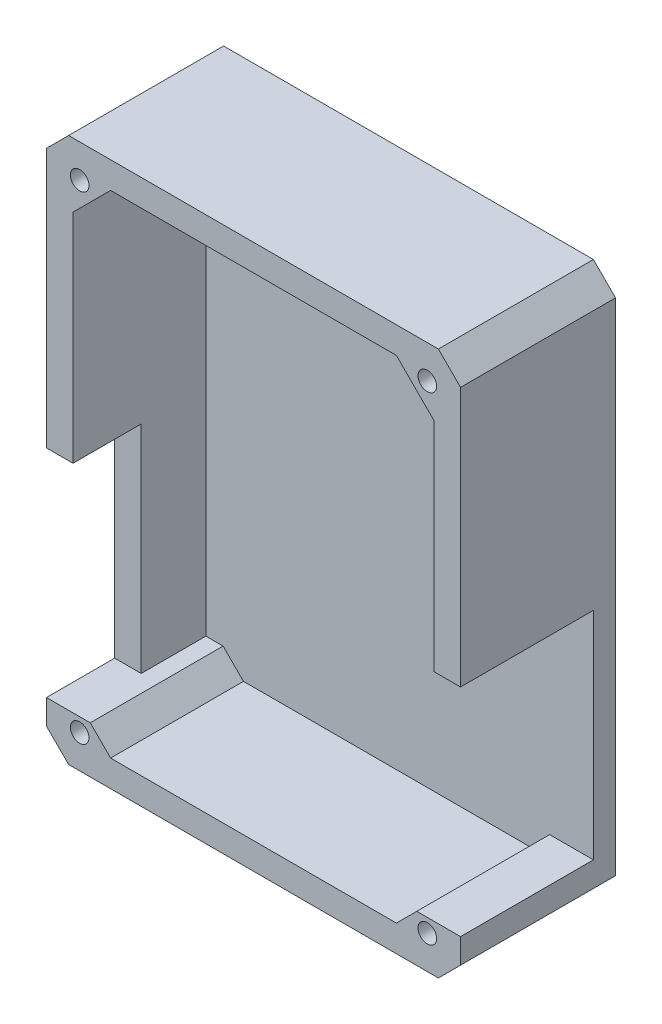
ISO-10303-21;
HEADER;
FILE_DESCRIPTION(('STEP AP214'),'2;1');
FILE_NAME('part.step','',(''),(''),'','','');
FILE_SCHEMA(('AUTOMOTIVE_DESIGN { 1 0 10303 214 1 1 1 1 }'));
ENDSEC;
DATA;
#1=APPLICATION_CONTEXT('core data for automotive mechanical design processes');
#2=APPLICATION_PROTOCOL_DEFINITION('international standard','automotive_design',2000,#1);
#3=PRODUCT_CONTEXT('',#1,'mechanical');
#4=PRODUCT('Part','Part','',(#3));
#5=PRODUCT_RELATED_PRODUCT_CATEGORY('part','',(#4));
#6=PRODUCT_DEFINITION_FORMATION('','',#4);
#7=PRODUCT_DEFINITION_CONTEXT('part definition',#1,'design');
#8=PRODUCT_DEFINITION('design','',#6,#7);
#9=PRODUCT_DEFINITION_SHAPE('','',#8);
#10=(LENGTH_UNIT() NAMED_UNIT(*) SI_UNIT(.MILLI.,.METRE.));
#11=(NAMED_UNIT(*) PLANE_ANGLE_UNIT() SI_UNIT($,.RADIAN.));
#12=(NAMED_UNIT(*) SI_UNIT($,.STERADIAN.) SOLID_ANGLE_UNIT());
#13=UNCERTAINTY_MEASURE_WITH_UNIT(LENGTH_MEASURE(1.E-05),#10,'distance_accuracy_value','');
#14=(GEOMETRIC_REPRESENTATION_CONTEXT(3) GLOBAL_UNCERTAINTY_ASSIGNED_CONTEXT((#13)) GLOBAL_UNIT_ASSIGNED_CONTEXT((#10,
#11,#12)) REPRESENTATION_CONTEXT('',''));
#15=CARTESIAN_POINT('',(0.,0.,0.));
#16=DIRECTION('',(0.,0.,1.));
#17=DIRECTION('',(1.,0.,0.));
#18=AXIS2_PLACEMENT_3D('',#15,#16,#17);
#19=CARTESIAN_POINT('',(0.,0.,5.));
#20=DIRECTION('',(0.,0.,-1.));
#21=DIRECTION('',(-1.,0.,0.));
#22=AXIS2_PLACEMENT_3D('',#19,#20,#21);
#23=PLANE('',#22);
#24=DIRECTION('',(0.,1.,0.));
#25=VECTOR('',#24,1.);
#26=CARTESIAN_POINT('',(-40.75,0.,5.));
#27=LINE('',#26,#25);
#28=CARTESIAN_POINT('',(-40.75,-22.4,5.));
#29=VERTEX_POINT('',#28);
#30=CARTESIAN_POINT('',(-40.75,75.5147186257614,5.));
#31=VERTEX_POINT('',#30);
#32=EDGE_CURVE('E382',#29,#31,#27,.T.);
#33=ORIENTED_EDGE('',*,*,#32,.F.);
#34=DIRECTION('',(1.,0.,0.));
#35=VECTOR('',#34,1.);
#36=CARTESIAN_POINT('',(0.,-22.3999999999999,5.));
#37=LINE('',#36,#35);
#38=CARTESIAN_POINT('',(-36.8647186257614,-22.4,5.));
#39=VERTEX_POINT('',#38);
#40=EDGE_CURVE('E310',#29,#39,#37,.T.);
#41=ORIENTED_EDGE('',*,*,#40,.T.);
#42=DIRECTION('',(0.707106781186546,-0.707106781186549,0.));
#43=VECTOR('',#42,1.);
#44=CARTESIAN_POINT('',(-29.6323593128808,-29.6323593128807,5.));
#45=LINE('',#44,#43);
#46=CARTESIAN_POINT('',(-32.2647186257614,-27.,5.));
#47=VERTEX_POINT('',#46);
#48=EDGE_CURVE('E309',#39,#47,#45,.T.);
#49=ORIENTED_EDGE('',*,*,#48,.T.);
#50=DIRECTION('',(1.,0.,0.));
#51=VECTOR('',#50,1.);
#52=CARTESIAN_POINT('',(0.,-27.,5.));
#53=LINE('',#52,#51);
#54=CARTESIAN_POINT('',(32.2647186257614,-27.,5.));
#55=VERTEX_POINT('',#54);
#56=EDGE_CURVE('E307',#47,#55,#53,.T.);
#57=ORIENTED_EDGE('',*,*,#56,.T.);
#58=DIRECTION('',(-0.707106781186546,-0.707106781186549,0.));
#59=VECTOR('',#58,1.);
#60=CARTESIAN_POINT('',(29.6323593128808,-29.6323593128807,5.));
#61=LINE('',#60,#59);
#62=CARTESIAN_POINT('',(36.8647186257614,-22.4,5.));
#63=VERTEX_POINT('',#62);
#64=EDGE_CURVE('E303',#63,#55,#61,.T.);
#65=ORIENTED_EDGE('',*,*,#64,.F.);
#66=DIRECTION('',(1.,0.,0.));
#67=VECTOR('',#66,1.);
#68=CARTESIAN_POINT('',(0.,-22.4,5.));
#69=LINE('',#68,#67);
#70=CARTESIAN_POINT('',(46.75,-22.4,5.));
#71=VERTEX_POINT('',#70);
#72=EDGE_CURVE('E301',#63,#71,#69,.T.);
#73=ORIENTED_EDGE('',*,*,#72,.T.);
#74=DIRECTION('',(0.,1.,0.));
#75=VECTOR('',#74,1.);
#76=CARTESIAN_POINT('',(46.75,-33.,5.));
#77=LINE('',#76,#75);
#78=CARTESIAN_POINT('',(46.75,26.4,5.));
#79=VERTEX_POINT('',#78);
#80=EDGE_CURVE('E236',#71,#79,#77,.T.);
#81=ORIENTED_EDGE('',*,*,#80,.T.);
#82=DIRECTION('',(1.,0.,0.));
#83=VECTOR('',#82,1.);
#84=CARTESIAN_POINT('',(0.,26.4,5.));
#85=LINE('',#84,#83);
#86=CARTESIAN_POINT('',(40.75,26.4,5.));
#87=VERTEX_POINT('',#86);
#88=EDGE_CURVE('E385',#87,#79,#85,.T.);
#89=ORIENTED_EDGE('',*,*,#88,.F.);
#90=DIRECTION('',(0.,-1.,0.));
#91=VECTOR('',#90,1.);
#92=CARTESIAN_POINT('',(40.75,0.,5.));
#93=LINE('',#92,#91);
#94=CARTESIAN_POINT('',(40.75,75.5147186257614,5.));
#95=VERTEX_POINT('',#94);
#96=EDGE_CURVE('E387',#95,#87,#93,.T.);
#97=ORIENTED_EDGE('',*,*,#96,.F.);
#98=DIRECTION('',(-0.707106781186546,0.707106781186549,0.));
#99=VECTOR('',#98,1.);
#100=CARTESIAN_POINT('',(58.1323593128808,58.1323593128806,5.));
#101=LINE('',#100,#99);
#102=CARTESIAN_POINT('',(32.2647186257614,84.,5.));
#103=VERTEX_POINT('',#102);
#104=EDGE_CURVE('E390',#95,#103,#101,.T.);
#105=ORIENTED_EDGE('',*,*,#104,.T.);
#106=DIRECTION('',(1.,0.,0.));
#107=VECTOR('',#106,1.);
#108=CARTESIAN_POINT('',(0.,84.,5.));
#109=LINE('',#108,#107);
#110=CARTESIAN_POINT('',(-32.2647186257614,84.,5.));
#111=VERTEX_POINT('',#110);
#112=EDGE_CURVE('E375',#111,#103,#109,.T.);
#113=ORIENTED_EDGE('',*,*,#112,.F.);
#114=DIRECTION('',(0.707106781186546,0.707106781186549,0.));
#115=VECTOR('',#114,1.);
#116=CARTESIAN_POINT('',(-58.1323593128808,58.1323593128806,5.));
#117=LINE('',#116,#115);
#118=EDGE_CURVE('E379',#31,#111,#117,.T.);
#119=ORIENTED_EDGE('',*,*,#118,.F.);
#120=EDGE_LOOP('',(#33,#41,#49,#57,#65,#73,#81,#89,#97,#105,#113,#119));
#121=FACE_BOUND('',#120,.T.);
#122=ADVANCED_FACE('F34',(#121),#23,.F.);
#123=CARTESIAN_POINT('',(0.,-22.3999999999999,35.));
#124=DIRECTION('',(0.,1.,0.));
#125=DIRECTION('',(-1.,0.,0.));
#126=AXIS2_PLACEMENT_3D('',#123,#124,#125);
#127=PLANE('',#126);
#128=ORIENTED_EDGE('',*,*,#40,.F.);
#129=DIRECTION('',(0.,0.,-1.));
#130=VECTOR('',#129,1.);
#131=CARTESIAN_POINT('',(-40.75,-22.4,19.6));
#132=LINE('',#131,#130);
#133=CARTESIAN_POINT('',(-40.75,-22.4,19.6));
#134=VERTEX_POINT('',#133);
#135=EDGE_CURVE('E210',#134,#29,#132,.T.);
#136=ORIENTED_EDGE('',*,*,#135,.F.);
#137=DIRECTION('',(1.,0.,0.));
#138=VECTOR('',#137,1.);
#139=CARTESIAN_POINT('',(-46.75,-22.4,19.6));
#140=LINE('',#139,#138);
#141=CARTESIAN_POINT('',(-46.75,-22.4,19.6));
#142=VERTEX_POINT('',#141);
#143=EDGE_CURVE('E194',#142,#134,#140,.T.);
#144=ORIENTED_EDGE('',*,*,#143,.F.);
#145=DIRECTION('',(0.,0.,-1.));
#146=VECTOR('',#145,1.);
#147=CARTESIAN_POINT('',(-46.75,-22.4,35.));
#148=LINE('',#147,#146);
#149=CARTESIAN_POINT('',(-46.75,-22.4,35.));
#150=VERTEX_POINT('',#149);
#151=EDGE_CURVE('E208',#150,#142,#148,.T.);
#152=ORIENTED_EDGE('',*,*,#151,.F.);
#153=DIRECTION('',(1.,0.,0.));
#154=VECTOR('',#153,1.);
#155=CARTESIAN_POINT('',(0.,-22.3999999999999,35.));
#156=LINE('',#155,#154);
#157=CARTESIAN_POINT('',(-36.8647186257614,-22.4,35.));
#158=VERTEX_POINT('',#157);
#159=EDGE_CURVE('E297',#150,#158,#156,.T.);
#160=ORIENTED_EDGE('',*,*,#159,.T.);
#161=DIRECTION('',(0.,0.,-1.));
#162=VECTOR('',#161,1.);
#163=CARTESIAN_POINT('',(-36.8647186257614,-22.4,35.));
#164=LINE('',#163,#162);
#165=EDGE_CURVE('E216',#158,#39,#164,.T.);
#166=ORIENTED_EDGE('',*,*,#165,.T.);
#167=EDGE_LOOP('',(#128,#136,#144,#152,#160,#166));
#168=FACE_BOUND('',#167,.T.);
#169=ADVANCED_FACE('F206',(#168),#127,.T.);
#170=CARTESIAN_POINT('',(-46.75,-33.,5.));
#171=DIRECTION('',(1.,0.,0.));
#172=DIRECTION('',(0.,0.,-1.));
#173=AXIS2_PLACEMENT_3D('',#170,#171,#172);
#174=PLANE('',#173);
#175=DIRECTION('',(0.,-1.,0.));
#176=VECTOR('',#175,1.);
#177=CARTESIAN_POINT('',(-46.75,-33.,0.));
#178=LINE('',#177,#176);
#179=CARTESIAN_POINT('',(-46.75,85.,0.));
#180=VERTEX_POINT('',#179);
#181=CARTESIAN_POINT('',(-46.75,-28.,0.));
#182=VERTEX_POINT('',#181);
#183=EDGE_CURVE('E235',#180,#182,#178,.T.);
#184=ORIENTED_EDGE('',*,*,#183,.T.);
#185=DIRECTION('',(0.,0.,1.));
#186=VECTOR('',#185,1.);
#187=CARTESIAN_POINT('',(-46.75,-28.,5.));
#188=LINE('',#187,#186);
#189=CARTESIAN_POINT('',(-46.75,-28.,35.));
#190=VERTEX_POINT('',#189);
#191=EDGE_CURVE('E11',#182,#190,#188,.T.);
#192=ORIENTED_EDGE('',*,*,#191,.T.);
#193=DIRECTION('',(0.,-1.,0.));
#194=VECTOR('',#193,1.);
#195=CARTESIAN_POINT('',(-46.75,0.,35.));
#196=LINE('',#195,#194);
#197=EDGE_CURVE('E214',#150,#190,#196,.T.);
#198=ORIENTED_EDGE('',*,*,#197,.F.);
#199=ORIENTED_EDGE('',*,*,#151,.T.);
#200=DIRECTION('',(0.,-1.,0.));
#201=VECTOR('',#200,1.);
#202=CARTESIAN_POINT('',(-46.75,26.4,19.6));
#203=LINE('',#202,#201);
#204=CARTESIAN_POINT('',(-46.75,26.4,19.6));
#205=VERTEX_POINT('',#204);
#206=EDGE_CURVE('E191',#205,#142,#203,.T.);
#207=ORIENTED_EDGE('',*,*,#206,.F.);
#208=DIRECTION('',(0.,0.,-1.));
#209=VECTOR('',#208,1.);
#210=CARTESIAN_POINT('',(-46.75,26.4,35.));
#211=LINE('',#210,#209);
#212=CARTESIAN_POINT('',(-46.75,26.4,35.));
#213=VERTEX_POINT('',#212);
#214=EDGE_CURVE('E357',#213,#205,#211,.T.);
#215=ORIENTED_EDGE('',*,*,#214,.F.);
#216=DIRECTION('',(0.,-1.,0.));
#217=VECTOR('',#216,1.);
#218=CARTESIAN_POINT('',(-46.75,0.,35.));
#219=LINE('',#218,#217);
#220=CARTESIAN_POINT('',(-46.75,85.,35.));
#221=VERTEX_POINT('',#220);
#222=EDGE_CURVE('E280',#221,#213,#219,.T.);
#223=ORIENTED_EDGE('',*,*,#222,.F.);
#224=DIRECTION('',(0.,0.,-1.));
#225=VECTOR('',#224,1.);
#226=CARTESIAN_POINT('',(-46.75,85.,5.));
#227=LINE('',#226,#225);
#228=EDGE_CURVE('E43',#221,#180,#227,.T.);
#229=ORIENTED_EDGE('',*,*,#228,.T.);
#230=EDGE_LOOP('',(#184,#192,#198,#199,#207,#215,#223,#229));
#231=FACE_BOUND('',#230,.T.);
#232=ADVANCED_FACE('F213',(#231),#174,.F.);
#233=CARTESIAN_POINT('',(-46.75,-33.,5.));
#234=DIRECTION('',(0.,1.,0.));
#235=DIRECTION('',(0.,0.,1.));
#236=AXIS2_PLACEMENT_3D('',#233,#234,#235);
#237=PLANE('',#236);
#238=DIRECTION('',(1.,0.,0.));
#239=VECTOR('',#238,1.);
#240=CARTESIAN_POINT('',(-46.75,-33.,0.));
#241=LINE('',#240,#239);
#242=CARTESIAN_POINT('',(-41.75,-33.,0.));
#243=VERTEX_POINT('',#242);
#244=CARTESIAN_POINT('',(41.75,-33.,0.));
#245=VERTEX_POINT('',#244);
#246=EDGE_CURVE('E241',#243,#245,#241,.T.);
#247=ORIENTED_EDGE('',*,*,#246,.T.);
#248=DIRECTION('',(0.,0.,1.));
#249=VECTOR('',#248,1.);
#250=CARTESIAN_POINT('',(41.75,-33.,5.));
#251=LINE('',#250,#249);
#252=CARTESIAN_POINT('',(41.75,-33.,35.));
#253=VERTEX_POINT('',#252);
#254=EDGE_CURVE('E56',#245,#253,#251,.T.);
#255=ORIENTED_EDGE('',*,*,#254,.T.);
#256=DIRECTION('',(1.,0.,0.));
#257=VECTOR('',#256,1.);
#258=CARTESIAN_POINT('',(0.,-33.,35.));
#259=LINE('',#258,#257);
#260=CARTESIAN_POINT('',(-41.75,-33.,35.));
#261=VERTEX_POINT('',#260);
#262=EDGE_CURVE('E292',#261,#253,#259,.T.);
#263=ORIENTED_EDGE('',*,*,#262,.F.);
#264=DIRECTION('',(0.,0.,-1.));
#265=VECTOR('',#264,1.);
#266=CARTESIAN_POINT('',(-41.75,-33.,5.));
#267=LINE('',#266,#265);
#268=EDGE_CURVE('E269',#261,#243,#267,.T.);
#269=ORIENTED_EDGE('',*,*,#268,.T.);
#270=EDGE_LOOP('',(#247,#255,#263,#269));
#271=FACE_BOUND('',#270,.T.);
#272=ADVANCED_FACE('F291',(#271),#237,.F.);
#273=CARTESIAN_POINT('',(46.75,-33.,5.));
#274=DIRECTION('',(-1.,0.,0.));
#275=DIRECTION('',(0.,0.,1.));
#276=AXIS2_PLACEMENT_3D('',#273,#274,#275);
#277=PLANE('',#276);
#278=DIRECTION('',(0.,1.,0.));
#279=VECTOR('',#278,1.);
#280=CARTESIAN_POINT('',(46.75,-33.,0.));
#281=LINE('',#280,#279);
#282=CARTESIAN_POINT('',(46.75,-28.,0.));
#283=VERTEX_POINT('',#282);
#284=CARTESIAN_POINT('',(46.75,85.,0.));
#285=VERTEX_POINT('',#284);
#286=EDGE_CURVE('E243',#283,#285,#281,.T.);
#287=ORIENTED_EDGE('',*,*,#286,.T.);
#288=DIRECTION('',(0.,0.,1.));
#289=VECTOR('',#288,1.);
#290=CARTESIAN_POINT('',(46.75,85.,5.));
#291=LINE('',#290,#289);
#292=CARTESIAN_POINT('',(46.75,85.,35.));
#293=VERTEX_POINT('',#292);
#294=EDGE_CURVE('E263',#285,#293,#291,.T.);
#295=ORIENTED_EDGE('',*,*,#294,.T.);
#296=DIRECTION('',(0.,1.,0.));
#297=VECTOR('',#296,1.);
#298=CARTESIAN_POINT('',(46.75,0.,35.));
#299=LINE('',#298,#297);
#300=CARTESIAN_POINT('',(46.75,26.4,35.));
#301=VERTEX_POINT('',#300);
#302=EDGE_CURVE('E353',#301,#293,#299,.T.);
#303=ORIENTED_EDGE('',*,*,#302,.F.);
#304=DIRECTION('',(0.,0.,-1.));
#305=VECTOR('',#304,1.);
#306=CARTESIAN_POINT('',(46.75,26.4,35.));
#307=LINE('',#306,#305);
#308=EDGE_CURVE('E351',#301,#79,#307,.T.);
#309=ORIENTED_EDGE('',*,*,#308,.T.);
#310=ORIENTED_EDGE('',*,*,#80,.F.);
#311=DIRECTION('',(0.,0.,-1.));
#312=VECTOR('',#311,1.);
#313=CARTESIAN_POINT('',(46.75,-22.4,35.));
#314=LINE('',#313,#312);
#315=CARTESIAN_POINT('',(46.75,-22.4,35.));
#316=VERTEX_POINT('',#315);
#317=EDGE_CURVE('E217',#316,#71,#314,.T.);
#318=ORIENTED_EDGE('',*,*,#317,.F.);
#319=DIRECTION('',(0.,1.,0.));
#320=VECTOR('',#319,1.);
#321=CARTESIAN_POINT('',(46.75,0.,35.));
#322=LINE('',#321,#320);
#323=CARTESIAN_POINT('',(46.75,-28.,35.));
#324=VERTEX_POINT('',#323);
#325=EDGE_CURVE('E223',#324,#316,#322,.T.);
#326=ORIENTED_EDGE('',*,*,#325,.F.);
#327=DIRECTION('',(0.,0.,-1.));
#328=VECTOR('',#327,1.);
#329=CARTESIAN_POINT('',(46.75,-28.,5.));
#330=LINE('',#329,#328);
#331=EDGE_CURVE('E260',#324,#283,#330,.T.);
#332=ORIENTED_EDGE('',*,*,#331,.T.);
#333=EDGE_LOOP('',(#287,#295,#303,#309,#310,#318,#326,#332));
#334=FACE_BOUND('',#333,.T.);
#335=ADVANCED_FACE('F347',(#334),#277,.F.);
#336=CARTESIAN_POINT('',(-46.75,90.,5.));
#337=DIRECTION('',(0.,-1.,0.));
#338=DIRECTION('',(0.,0.,-1.));
#339=AXIS2_PLACEMENT_3D('',#336,#337,#338);
#340=PLANE('',#339);
#341=DIRECTION('',(-1.,0.,0.));
#342=VECTOR('',#341,1.);
#343=CARTESIAN_POINT('',(0.,90.,35.));
#344=LINE('',#343,#342);
#345=CARTESIAN_POINT('',(41.75,90.,35.));
#346=VERTEX_POINT('',#345);
#347=CARTESIAN_POINT('',(-41.75,90.,35.));
#348=VERTEX_POINT('',#347);
#349=EDGE_CURVE('E400',#346,#348,#344,.T.);
#350=ORIENTED_EDGE('',*,*,#349,.F.);
#351=DIRECTION('',(0.,0.,-1.));
#352=VECTOR('',#351,1.);
#353=CARTESIAN_POINT('',(41.75,90.,5.));
#354=LINE('',#353,#352);
#355=CARTESIAN_POINT('',(41.75,90.,0.));
#356=VERTEX_POINT('',#355);
#357=EDGE_CURVE('E249',#346,#356,#354,.T.);
#358=ORIENTED_EDGE('',*,*,#357,.T.);
#359=DIRECTION('',(-1.,0.,0.));
#360=VECTOR('',#359,1.);
#361=CARTESIAN_POINT('',(-46.75,90.,0.));
#362=LINE('',#361,#360);
#363=CARTESIAN_POINT('',(-41.75,90.,0.));
#364=VERTEX_POINT('',#363);
#365=EDGE_CURVE('E239',#356,#364,#362,.T.);
#366=ORIENTED_EDGE('',*,*,#365,.T.);
#367=DIRECTION('',(0.,0.,1.));
#368=VECTOR('',#367,1.);
#369=CARTESIAN_POINT('',(-41.75,90.,5.));
#370=LINE('',#369,#368);
#371=EDGE_CURVE('E238',#364,#348,#370,.T.);
#372=ORIENTED_EDGE('',*,*,#371,.T.);
#373=EDGE_LOOP('',(#350,#358,#366,#372));
#374=FACE_BOUND('',#373,.T.);
#375=ADVANCED_FACE('F472',(#374),#340,.F.);
#376=CARTESIAN_POINT('',(0.,0.,0.));
#377=DIRECTION('',(0.,0.,-1.));
#378=DIRECTION('',(-1.,0.,0.));
#379=AXIS2_PLACEMENT_3D('',#376,#377,#378);
#380=PLANE('',#379);
#381=CARTESIAN_POINT('',(-33.3074446131292,-24.,0.));
#382=DIRECTION('',(0.,0.,-1.));
#383=DIRECTION('',(1.,0.,0.));
#384=AXIS2_PLACEMENT_3D('',#381,#382,#383);
#385=CIRCLE('',#384,2.1);
#386=CARTESIAN_POINT('',(-31.2074446131292,-24.,0.));
#387=VERTEX_POINT('',#386);
#388=EDGE_CURVE('E443',#387,#387,#385,.T.);
#389=ORIENTED_EDGE('',*,*,#388,.F.);
#390=EDGE_LOOP('',(#389));
#391=FACE_BOUND('',#390,.T.);
#392=CARTESIAN_POINT('',(-33.3074446131292,32.,0.));
#393=DIRECTION('',(0.,0.,-1.));
#394=DIRECTION('',(1.,0.,0.));
#395=AXIS2_PLACEMENT_3D('',#392,#393,#394);
#396=CIRCLE('',#395,2.1);
#397=CARTESIAN_POINT('',(-31.2074446131292,32.,0.));
#398=VERTEX_POINT('',#397);
#399=EDGE_CURVE('E449',#398,#398,#396,.T.);
#400=ORIENTED_EDGE('',*,*,#399,.F.);
#401=EDGE_LOOP('',(#400));
#402=FACE_BOUND('',#401,.T.);
#403=CARTESIAN_POINT('',(33.3074446131292,32.,0.));
#404=DIRECTION('',(0.,0.,-1.));
#405=DIRECTION('',(-1.,0.,0.));
#406=AXIS2_PLACEMENT_3D('',#403,#404,#405);
#407=CIRCLE('',#406,2.1);
#408=CARTESIAN_POINT('',(31.2074446131292,32.,0.));
#409=VERTEX_POINT('',#408);
#410=EDGE_CURVE('E455',#409,#409,#407,.T.);
#411=ORIENTED_EDGE('',*,*,#410,.F.);
#412=EDGE_LOOP('',(#411));
#413=FACE_BOUND('',#412,.T.);
#414=CARTESIAN_POINT('',(33.3074446131292,-24.,0.));
#415=DIRECTION('',(0.,0.,-1.));
#416=DIRECTION('',(-1.,0.,0.));
#417=AXIS2_PLACEMENT_3D('',#414,#415,#416);
#418=CIRCLE('',#417,2.1);
#419=CARTESIAN_POINT('',(31.2074446131292,-24.,0.));
#420=VERTEX_POINT('',#419);
#421=EDGE_CURVE('E437',#420,#420,#418,.T.);
#422=ORIENTED_EDGE('',*,*,#421,.F.);
#423=EDGE_LOOP('',(#422));
#424=FACE_BOUND('',#423,.T.);
#425=ORIENTED_EDGE('',*,*,#365,.F.);
#426=DIRECTION('',(-0.707106781186545,0.70710678118655,0.));
#427=VECTOR('',#426,1.);
#428=CARTESIAN_POINT('',(65.8750000000002,65.8749999999997,0.));
#429=LINE('',#428,#427);
#430=EDGE_CURVE('E258',#356,#285,#429,.F.);
#431=ORIENTED_EDGE('',*,*,#430,.T.);
#432=ORIENTED_EDGE('',*,*,#286,.F.);
#433=DIRECTION('',(0.707106781186548,0.707106781186547,0.));
#434=VECTOR('',#433,1.);
#435=CARTESIAN_POINT('',(37.375,-37.375,0.));
#436=LINE('',#435,#434);
#437=EDGE_CURVE('E256',#283,#245,#436,.F.);
#438=ORIENTED_EDGE('',*,*,#437,.T.);
#439=ORIENTED_EDGE('',*,*,#246,.F.);
#440=DIRECTION('',(0.707106781186546,-0.707106781186549,0.));
#441=VECTOR('',#440,1.);
#442=CARTESIAN_POINT('',(-37.3750000000001,-37.3749999999999,0.));
#443=LINE('',#442,#441);
#444=EDGE_CURVE('E254',#243,#182,#443,.F.);
#445=ORIENTED_EDGE('',*,*,#444,.T.);
#446=ORIENTED_EDGE('',*,*,#183,.F.);
#447=DIRECTION('',(-0.707106781186549,-0.707106781186547,0.));
#448=VECTOR('',#447,1.);
#449=CARTESIAN_POINT('',(-65.8749999999999,65.8750000000001,0.));
#450=LINE('',#449,#448);
#451=EDGE_CURVE('E252',#180,#364,#450,.F.);
#452=ORIENTED_EDGE('',*,*,#451,.T.);
#453=EDGE_LOOP('',(#425,#431,#432,#438,#439,#445,#446,#452));
#454=FACE_BOUND('',#453,.T.);
#455=ADVANCED_FACE('F285',(#391,#402,#413,#424,#454),#380,.T.);
#456=CARTESIAN_POINT('',(0.,-22.4,35.));
#457=DIRECTION('',(0.,1.,0.));
#458=DIRECTION('',(0.,0.,1.));
#459=AXIS2_PLACEMENT_3D('',#456,#457,#458);
#460=PLANE('',#459);
#461=ORIENTED_EDGE('',*,*,#72,.F.);
#462=DIRECTION('',(0.,0.,-1.));
#463=VECTOR('',#462,1.);
#464=CARTESIAN_POINT('',(36.8647186257614,-22.4,35.));
#465=LINE('',#464,#463);
#466=CARTESIAN_POINT('',(36.8647186257614,-22.4,35.));
#467=VERTEX_POINT('',#466);
#468=EDGE_CURVE('E232',#467,#63,#465,.T.);
#469=ORIENTED_EDGE('',*,*,#468,.F.);
#470=DIRECTION('',(1.,0.,0.));
#471=VECTOR('',#470,1.);
#472=CARTESIAN_POINT('',(0.,-22.4,35.));
#473=LINE('',#472,#471);
#474=EDGE_CURVE('E311',#467,#316,#473,.T.);
#475=ORIENTED_EDGE('',*,*,#474,.T.);
#476=ORIENTED_EDGE('',*,*,#317,.T.);
#477=EDGE_LOOP('',(#461,#469,#475,#476));
#478=FACE_BOUND('',#477,.T.);
#479=ADVANCED_FACE('F341',(#478),#460,.T.);
#480=CARTESIAN_POINT('',(29.6323593128808,-29.6323593128807,35.));
#481=DIRECTION('',(0.707106781186549,-0.707106781186546,0.));
#482=DIRECTION('',(0.707106781186546,0.707106781186549,0.));
#483=AXIS2_PLACEMENT_3D('',#480,#481,#482);
#484=PLANE('',#483);
#485=ORIENTED_EDGE('',*,*,#64,.T.);
#486=DIRECTION('',(0.,0.,-1.));
#487=VECTOR('',#486,1.);
#488=CARTESIAN_POINT('',(32.2647186257614,-27.,35.));
#489=LINE('',#488,#487);
#490=CARTESIAN_POINT('',(32.2647186257614,-27.,35.));
#491=VERTEX_POINT('',#490);
#492=EDGE_CURVE('E229',#491,#55,#489,.T.);
#493=ORIENTED_EDGE('',*,*,#492,.F.);
#494=DIRECTION('',(-0.707106781186546,-0.707106781186549,0.));
#495=VECTOR('',#494,1.);
#496=CARTESIAN_POINT('',(29.6323593128808,-29.6323593128807,35.));
#497=LINE('',#496,#495);
#498=EDGE_CURVE('E314',#467,#491,#497,.T.);
#499=ORIENTED_EDGE('',*,*,#498,.F.);
#500=ORIENTED_EDGE('',*,*,#468,.T.);
#501=EDGE_LOOP('',(#485,#493,#499,#500));
#502=FACE_BOUND('',#501,.T.);
#503=ADVANCED_FACE('F339',(#502),#484,.F.);
#504=CARTESIAN_POINT('',(0.,-27.,35.));
#505=DIRECTION('',(0.,1.,0.));
#506=DIRECTION('',(0.,0.,1.));
#507=AXIS2_PLACEMENT_3D('',#504,#505,#506);
#508=PLANE('',#507);
#509=ORIENTED_EDGE('',*,*,#56,.F.);
#510=DIRECTION('',(0.,0.,-1.));
#511=VECTOR('',#510,1.);
#512=CARTESIAN_POINT('',(-32.2647186257614,-27.,35.));
#513=LINE('',#512,#511);
#514=CARTESIAN_POINT('',(-32.2647186257614,-27.,35.));
#515=VERTEX_POINT('',#514);
#516=EDGE_CURVE('E220',#515,#47,#513,.T.);
#517=ORIENTED_EDGE('',*,*,#516,.F.);
#518=DIRECTION('',(1.,0.,0.));
#519=VECTOR('',#518,1.);
#520=CARTESIAN_POINT('',(0.,-27.,35.));
#521=LINE('',#520,#519);
#522=EDGE_CURVE('E318',#515,#491,#521,.T.);
#523=ORIENTED_EDGE('',*,*,#522,.T.);
#524=ORIENTED_EDGE('',*,*,#492,.T.);
#525=EDGE_LOOP('',(#509,#517,#523,#524));
#526=FACE_BOUND('',#525,.T.);
#527=ADVANCED_FACE('F336',(#526),#508,.T.);
#528=CARTESIAN_POINT('',(-29.6323593128808,-29.6323593128807,35.));
#529=DIRECTION('',(0.707106781186549,0.707106781186546,0.));
#530=DIRECTION('',(-0.707106781186546,0.707106781186549,0.));
#531=AXIS2_PLACEMENT_3D('',#528,#529,#530);
#532=PLANE('',#531);
#533=ORIENTED_EDGE('',*,*,#48,.F.);
#534=ORIENTED_EDGE('',*,*,#165,.F.);
#535=DIRECTION('',(0.707106781186546,-0.707106781186549,0.));
#536=VECTOR('',#535,1.);
#537=CARTESIAN_POINT('',(-29.6323593128808,-29.6323593128807,35.));
#538=LINE('',#537,#536);
#539=EDGE_CURVE('E325',#158,#515,#538,.T.);
#540=ORIENTED_EDGE('',*,*,#539,.T.);
#541=ORIENTED_EDGE('',*,*,#516,.T.);
#542=EDGE_LOOP('',(#533,#534,#540,#541));
#543=FACE_BOUND('',#542,.T.);
#544=ADVANCED_FACE('F332',(#543),#532,.T.);
#545=CARTESIAN_POINT('',(0.,0.,35.));
#546=DIRECTION('',(0.,0.,1.));
#547=DIRECTION('',(1.,0.,0.));
#548=AXIS2_PLACEMENT_3D('',#545,#546,#547);
#549=PLANE('',#548);
#550=CARTESIAN_POINT('',(-39.25,-25.5,35.));
#551=DIRECTION('',(0.,0.,1.));
#552=DIRECTION('',(-1.,0.,0.));
#553=AXIS2_PLACEMENT_3D('',#550,#551,#552);
#554=CIRCLE('',#553,2.1);
#555=CARTESIAN_POINT('',(-41.35,-25.5,35.));
#556=VERTEX_POINT('',#555);
#557=EDGE_CURVE('E426',#556,#556,#554,.T.);
#558=ORIENTED_EDGE('',*,*,#557,.F.);
#559=EDGE_LOOP('',(#558));
#560=FACE_BOUND('',#559,.T.);
#561=CARTESIAN_POINT('',(39.2499999999998,-25.5000000000001,35.));
#562=DIRECTION('',(0.,0.,1.));
#563=DIRECTION('',(1.,0.,0.));
#564=AXIS2_PLACEMENT_3D('',#561,#562,#563);
#565=CIRCLE('',#564,2.1);
#566=CARTESIAN_POINT('',(41.3499999999998,-25.5000000000001,35.));
#567=VERTEX_POINT('',#566);
#568=EDGE_CURVE('E431',#567,#567,#565,.T.);
#569=ORIENTED_EDGE('',*,*,#568,.F.);
#570=EDGE_LOOP('',(#569));
#571=FACE_BOUND('',#570,.T.);
#572=ORIENTED_EDGE('',*,*,#262,.T.);
#573=DIRECTION('',(-0.707106781186548,-0.707106781186547,0.));
#574=VECTOR('',#573,1.);
#575=CARTESIAN_POINT('',(37.375,-37.375,35.));
#576=LINE('',#575,#574);
#577=EDGE_CURVE('E275',#253,#324,#576,.F.);
#578=ORIENTED_EDGE('',*,*,#577,.T.);
#579=ORIENTED_EDGE('',*,*,#325,.T.);
#580=ORIENTED_EDGE('',*,*,#474,.F.);
#581=ORIENTED_EDGE('',*,*,#498,.T.);
#582=ORIENTED_EDGE('',*,*,#522,.F.);
#583=ORIENTED_EDGE('',*,*,#539,.F.);
#584=ORIENTED_EDGE('',*,*,#159,.F.);
#585=ORIENTED_EDGE('',*,*,#197,.T.);
#586=DIRECTION('',(-0.707106781186546,0.707106781186549,0.));
#587=VECTOR('',#586,1.);
#588=CARTESIAN_POINT('',(-37.3750000000001,-37.3749999999999,35.));
#589=LINE('',#588,#587);
#590=EDGE_CURVE('E273',#190,#261,#589,.F.);
#591=ORIENTED_EDGE('',*,*,#590,.T.);
#592=EDGE_LOOP('',(#572,#578,#579,#580,#581,#582,#583,#584,#585,#591));
#593=FACE_BOUND('',#592,.T.);
#594=ADVANCED_FACE('F329',(#560,#571,#593),#549,.T.);
#595=CARTESIAN_POINT('',(58.1323593128808,58.1323593128806,35.));
#596=DIRECTION('',(-0.707106781186549,-0.707106781186546,0.));
#597=DIRECTION('',(0.707106781186546,-0.707106781186549,0.));
#598=AXIS2_PLACEMENT_3D('',#595,#596,#597);
#599=PLANE('',#598);
#600=ORIENTED_EDGE('',*,*,#104,.F.);
#601=DIRECTION('',(0.,0.,-1.));
#602=VECTOR('',#601,1.);
#603=CARTESIAN_POINT('',(40.75,75.5147186257614,35.));
#604=LINE('',#603,#602);
#605=CARTESIAN_POINT('',(40.75,75.5147186257614,35.));
#606=VERTEX_POINT('',#605);
#607=EDGE_CURVE('E304',#606,#95,#604,.T.);
#608=ORIENTED_EDGE('',*,*,#607,.F.);
#609=DIRECTION('',(-0.707106781186546,0.707106781186549,0.));
#610=VECTOR('',#609,1.);
#611=CARTESIAN_POINT('',(58.1323593128808,58.1323593128806,35.));
#612=LINE('',#611,#610);
#613=CARTESIAN_POINT('',(32.2647186257614,84.,35.));
#614=VERTEX_POINT('',#613);
#615=EDGE_CURVE('E378',#606,#614,#612,.T.);
#616=ORIENTED_EDGE('',*,*,#615,.T.);
#617=DIRECTION('',(0.,0.,-1.));
#618=VECTOR('',#617,1.);
#619=CARTESIAN_POINT('',(32.2647186257614,84.,35.));
#620=LINE('',#619,#618);
#621=EDGE_CURVE('E371',#614,#103,#620,.T.);
#622=ORIENTED_EDGE('',*,*,#621,.T.);
#623=EDGE_LOOP('',(#600,#608,#616,#622));
#624=FACE_BOUND('',#623,.T.);
#625=ADVANCED_FACE('F555',(#624),#599,.T.);
#626=CARTESIAN_POINT('',(40.75,0.,35.));
#627=DIRECTION('',(1.,0.,0.));
#628=DIRECTION('',(0.,0.,-1.));
#629=AXIS2_PLACEMENT_3D('',#626,#627,#628);
#630=PLANE('',#629);
#631=ORIENTED_EDGE('',*,*,#96,.T.);
#632=DIRECTION('',(0.,0.,-1.));
#633=VECTOR('',#632,1.);
#634=CARTESIAN_POINT('',(40.75,26.4,35.));
#635=LINE('',#634,#633);
#636=CARTESIAN_POINT('',(40.75,26.4,35.));
#637=VERTEX_POINT('',#636);
#638=EDGE_CURVE('E356',#637,#87,#635,.T.);
#639=ORIENTED_EDGE('',*,*,#638,.F.);
#640=DIRECTION('',(0.,-1.,0.));
#641=VECTOR('',#640,1.);
#642=CARTESIAN_POINT('',(40.75,0.,35.));
#643=LINE('',#642,#641);
#644=EDGE_CURVE('E406',#606,#637,#643,.T.);
#645=ORIENTED_EDGE('',*,*,#644,.F.);
#646=ORIENTED_EDGE('',*,*,#607,.T.);
#647=EDGE_LOOP('',(#631,#639,#645,#646));
#648=FACE_BOUND('',#647,.T.);
#649=ADVANCED_FACE('F550',(#648),#630,.F.);
#650=CARTESIAN_POINT('',(0.,26.4,35.));
#651=DIRECTION('',(0.,1.,0.));
#652=DIRECTION('',(0.,0.,1.));
#653=AXIS2_PLACEMENT_3D('',#650,#651,#652);
#654=PLANE('',#653);
#655=ORIENTED_EDGE('',*,*,#88,.T.);
#656=ORIENTED_EDGE('',*,*,#308,.F.);
#657=DIRECTION('',(1.,0.,0.));
#658=VECTOR('',#657,1.);
#659=CARTESIAN_POINT('',(0.,26.4,35.));
#660=LINE('',#659,#658);
#661=EDGE_CURVE('E404',#637,#301,#660,.T.);
#662=ORIENTED_EDGE('',*,*,#661,.F.);
#663=ORIENTED_EDGE('',*,*,#638,.T.);
#664=EDGE_LOOP('',(#655,#656,#662,#663));
#665=FACE_BOUND('',#664,.T.);
#666=ADVANCED_FACE('F548',(#665),#654,.F.);
#667=CARTESIAN_POINT('',(0.,26.4,35.));
#668=DIRECTION('',(0.,1.,0.));
#669=DIRECTION('',(-1.,0.,0.));
#670=AXIS2_PLACEMENT_3D('',#667,#668,#669);
#671=PLANE('',#670);
#672=ORIENTED_EDGE('',*,*,#214,.T.);
#673=DIRECTION('',(-1.,0.,0.));
#674=VECTOR('',#673,1.);
#675=CARTESIAN_POINT('',(-46.75,26.4,19.6));
#676=LINE('',#675,#674);
#677=CARTESIAN_POINT('',(-40.75,26.4,19.6));
#678=VERTEX_POINT('',#677);
#679=EDGE_CURVE('E197',#678,#205,#676,.T.);
#680=ORIENTED_EDGE('',*,*,#679,.F.);
#681=DIRECTION('',(0.,0.,-1.));
#682=VECTOR('',#681,1.);
#683=CARTESIAN_POINT('',(-40.75,26.4,35.));
#684=LINE('',#683,#682);
#685=CARTESIAN_POINT('',(-40.75,26.4,35.));
#686=VERTEX_POINT('',#685);
#687=EDGE_CURVE('E360',#686,#678,#684,.T.);
#688=ORIENTED_EDGE('',*,*,#687,.F.);
#689=DIRECTION('',(1.,0.,0.));
#690=VECTOR('',#689,1.);
#691=CARTESIAN_POINT('',(0.,26.4,35.));
#692=LINE('',#691,#690);
#693=EDGE_CURVE('E397',#213,#686,#692,.T.);
#694=ORIENTED_EDGE('',*,*,#693,.F.);
#695=EDGE_LOOP('',(#672,#680,#688,#694));
#696=FACE_BOUND('',#695,.T.);
#697=ADVANCED_FACE('F569',(#696),#671,.F.);
#698=CARTESIAN_POINT('',(-40.75,0.,35.));
#699=DIRECTION('',(-1.,0.,0.));
#700=DIRECTION('',(0.,0.,1.));
#701=AXIS2_PLACEMENT_3D('',#698,#699,#700);
#702=PLANE('',#701);
#703=ORIENTED_EDGE('',*,*,#32,.T.);
#704=DIRECTION('',(0.,0.,-1.));
#705=VECTOR('',#704,1.);
#706=CARTESIAN_POINT('',(-40.75,75.5147186257614,35.));
#707=LINE('',#706,#705);
#708=CARTESIAN_POINT('',(-40.75,75.5147186257614,35.));
#709=VERTEX_POINT('',#708);
#710=EDGE_CURVE('E365',#709,#31,#707,.T.);
#711=ORIENTED_EDGE('',*,*,#710,.F.);
#712=DIRECTION('',(0.,1.,0.));
#713=VECTOR('',#712,1.);
#714=CARTESIAN_POINT('',(-40.75,0.,35.));
#715=LINE('',#714,#713);
#716=EDGE_CURVE('E395',#686,#709,#715,.T.);
#717=ORIENTED_EDGE('',*,*,#716,.F.);
#718=ORIENTED_EDGE('',*,*,#687,.T.);
#719=DIRECTION('',(0.,1.,0.));
#720=VECTOR('',#719,1.);
#721=CARTESIAN_POINT('',(-40.75,26.4,19.6));
#722=LINE('',#721,#720);
#723=EDGE_CURVE('E211',#134,#678,#722,.T.);
#724=ORIENTED_EDGE('',*,*,#723,.F.);
#725=ORIENTED_EDGE('',*,*,#135,.T.);
#726=EDGE_LOOP('',(#703,#711,#717,#718,#724,#725));
#727=FACE_BOUND('',#726,.T.);
#728=ADVANCED_FACE('F565',(#727),#702,.F.);
#729=CARTESIAN_POINT('',(-58.1323593128808,58.1323593128806,35.));
#730=DIRECTION('',(-0.707106781186549,0.707106781186546,0.));
#731=DIRECTION('',(-0.707106781186546,-0.707106781186549,0.));
#732=AXIS2_PLACEMENT_3D('',#729,#730,#731);
#733=PLANE('',#732);
#734=ORIENTED_EDGE('',*,*,#118,.T.);
#735=DIRECTION('',(0.,0.,-1.));
#736=VECTOR('',#735,1.);
#737=CARTESIAN_POINT('',(-32.2647186257614,84.,35.));
#738=LINE('',#737,#736);
#739=CARTESIAN_POINT('',(-32.2647186257614,84.,35.));
#740=VERTEX_POINT('',#739);
#741=EDGE_CURVE('E368',#740,#111,#738,.T.);
#742=ORIENTED_EDGE('',*,*,#741,.F.);
#743=DIRECTION('',(0.707106781186546,0.707106781186549,0.));
#744=VECTOR('',#743,1.);
#745=CARTESIAN_POINT('',(-58.1323593128808,58.1323593128806,35.));
#746=LINE('',#745,#744);
#747=EDGE_CURVE('E393',#709,#740,#746,.T.);
#748=ORIENTED_EDGE('',*,*,#747,.F.);
#749=ORIENTED_EDGE('',*,*,#710,.T.);
#750=EDGE_LOOP('',(#734,#742,#748,#749));
#751=FACE_BOUND('',#750,.T.);
#752=ADVANCED_FACE('F562',(#751),#733,.F.);
#753=CARTESIAN_POINT('',(0.,84.,35.));
#754=DIRECTION('',(0.,1.,0.));
#755=DIRECTION('',(0.,0.,1.));
#756=AXIS2_PLACEMENT_3D('',#753,#754,#755);
#757=PLANE('',#756);
#758=ORIENTED_EDGE('',*,*,#112,.T.);
#759=ORIENTED_EDGE('',*,*,#621,.F.);
#760=DIRECTION('',(1.,0.,0.));
#761=VECTOR('',#760,1.);
#762=CARTESIAN_POINT('',(0.,84.,35.));
#763=LINE('',#762,#761);
#764=EDGE_CURVE('E374',#740,#614,#763,.T.);
#765=ORIENTED_EDGE('',*,*,#764,.F.);
#766=ORIENTED_EDGE('',*,*,#741,.T.);
#767=EDGE_LOOP('',(#758,#759,#765,#766));
#768=FACE_BOUND('',#767,.T.);
#769=ADVANCED_FACE('F558',(#768),#757,.F.);
#770=CARTESIAN_POINT('',(0.,0.,35.));
#771=DIRECTION('',(0.,0.,1.));
#772=DIRECTION('',(1.,0.,0.));
#773=AXIS2_PLACEMENT_3D('',#770,#771,#772);
#774=PLANE('',#773);
#775=CARTESIAN_POINT('',(39.25,82.4999999999999,35.));
#776=DIRECTION('',(0.,0.,1.));
#777=DIRECTION('',(-1.,0.,0.));
#778=AXIS2_PLACEMENT_3D('',#775,#776,#777);
#779=CIRCLE('',#778,2.1);
#780=CARTESIAN_POINT('',(37.15,82.4999999999999,35.));
#781=VERTEX_POINT('',#780);
#782=EDGE_CURVE('E419',#781,#781,#779,.T.);
#783=ORIENTED_EDGE('',*,*,#782,.F.);
#784=EDGE_LOOP('',(#783));
#785=FACE_BOUND('',#784,.T.);
#786=CARTESIAN_POINT('',(-39.25,82.5,35.));
#787=DIRECTION('',(0.,0.,1.));
#788=DIRECTION('',(1.,0.,0.));
#789=AXIS2_PLACEMENT_3D('',#786,#787,#788);
#790=CIRCLE('',#789,2.1);
#791=CARTESIAN_POINT('',(-37.15,82.5,35.));
#792=VERTEX_POINT('',#791);
#793=EDGE_CURVE('E413',#792,#792,#790,.T.);
#794=ORIENTED_EDGE('',*,*,#793,.F.);
#795=EDGE_LOOP('',(#794));
#796=FACE_BOUND('',#795,.T.);
#797=ORIENTED_EDGE('',*,*,#302,.T.);
#798=DIRECTION('',(0.707106781186545,-0.70710678118655,0.));
#799=VECTOR('',#798,1.);
#800=CARTESIAN_POINT('',(65.8750000000002,65.8749999999997,35.));
#801=LINE('',#800,#799);
#802=EDGE_CURVE('E267',#293,#346,#801,.F.);
#803=ORIENTED_EDGE('',*,*,#802,.T.);
#804=ORIENTED_EDGE('',*,*,#349,.T.);
#805=DIRECTION('',(0.707106781186549,0.707106781186547,0.));
#806=VECTOR('',#805,1.);
#807=CARTESIAN_POINT('',(-65.8749999999999,65.8750000000001,35.));
#808=LINE('',#807,#806);
#809=EDGE_CURVE('E265',#348,#221,#808,.F.);
#810=ORIENTED_EDGE('',*,*,#809,.T.);
#811=ORIENTED_EDGE('',*,*,#222,.T.);
#812=ORIENTED_EDGE('',*,*,#693,.T.);
#813=ORIENTED_EDGE('',*,*,#716,.T.);
#814=ORIENTED_EDGE('',*,*,#747,.T.);
#815=ORIENTED_EDGE('',*,*,#764,.T.);
#816=ORIENTED_EDGE('',*,*,#615,.F.);
#817=ORIENTED_EDGE('',*,*,#644,.T.);
#818=ORIENTED_EDGE('',*,*,#661,.T.);
#819=EDGE_LOOP('',(#797,#803,#804,#810,#811,#812,#813,#814,#815,#816,#817,#818));
#820=FACE_BOUND('',#819,.T.);
#821=ADVANCED_FACE('F519',(#785,#796,#820),#774,.T.);
#822=CARTESIAN_POINT('',(41.75,90.,5.));
#823=DIRECTION('',(-0.70710678118655,-0.707106781186545,0.));
#824=DIRECTION('',(0.,0.,-1.));
#825=AXIS2_PLACEMENT_3D('',#822,#823,#824);
#826=PLANE('',#825);
#827=ORIENTED_EDGE('',*,*,#802,.F.);
#828=ORIENTED_EDGE('',*,*,#294,.F.);
#829=ORIENTED_EDGE('',*,*,#430,.F.);
#830=ORIENTED_EDGE('',*,*,#357,.F.);
#831=EDGE_LOOP('',(#827,#828,#829,#830));
#832=FACE_BOUND('',#831,.T.);
#833=ADVANCED_FACE('F512',(#832),#826,.F.);
#834=CARTESIAN_POINT('',(46.75,-28.,5.));
#835=DIRECTION('',(-0.707106781186547,0.707106781186548,0.));
#836=DIRECTION('',(0.,0.,-1.));
#837=AXIS2_PLACEMENT_3D('',#834,#835,#836);
#838=PLANE('',#837);
#839=ORIENTED_EDGE('',*,*,#577,.F.);
#840=ORIENTED_EDGE('',*,*,#254,.F.);
#841=ORIENTED_EDGE('',*,*,#437,.F.);
#842=ORIENTED_EDGE('',*,*,#331,.F.);
#843=EDGE_LOOP('',(#839,#840,#841,#842));
#844=FACE_BOUND('',#843,.T.);
#845=ADVANCED_FACE('F518',(#844),#838,.F.);
#846=CARTESIAN_POINT('',(-41.75,-33.,5.));
#847=DIRECTION('',(0.707106781186549,0.707106781186546,0.));
#848=DIRECTION('',(0.,0.,-1.));
#849=AXIS2_PLACEMENT_3D('',#846,#847,#848);
#850=PLANE('',#849);
#851=ORIENTED_EDGE('',*,*,#590,.F.);
#852=ORIENTED_EDGE('',*,*,#191,.F.);
#853=ORIENTED_EDGE('',*,*,#444,.F.);
#854=ORIENTED_EDGE('',*,*,#268,.F.);
#855=EDGE_LOOP('',(#851,#852,#853,#854));
#856=FACE_BOUND('',#855,.T.);
#857=ADVANCED_FACE('F290',(#856),#850,.F.);
#858=CARTESIAN_POINT('',(-46.75,85.,5.));
#859=DIRECTION('',(0.707106781186547,-0.707106781186549,0.));
#860=DIRECTION('',(0.,0.,-1.));
#861=AXIS2_PLACEMENT_3D('',#858,#859,#860);
#862=PLANE('',#861);
#863=ORIENTED_EDGE('',*,*,#809,.F.);
#864=ORIENTED_EDGE('',*,*,#371,.F.);
#865=ORIENTED_EDGE('',*,*,#451,.F.);
#866=ORIENTED_EDGE('',*,*,#228,.F.);
#867=EDGE_LOOP('',(#863,#864,#865,#866));
#868=FACE_BOUND('',#867,.T.);
#869=ADVANCED_FACE('F37',(#868),#862,.F.);
#870=CARTESIAN_POINT('',(0.,0.,19.6));
#871=DIRECTION('',(0.,0.,1.));
#872=DIRECTION('',(1.,0.,0.));
#873=AXIS2_PLACEMENT_3D('',#870,#871,#872);
#874=PLANE('',#873);
#875=ORIENTED_EDGE('',*,*,#206,.T.);
#876=ORIENTED_EDGE('',*,*,#143,.T.);
#877=ORIENTED_EDGE('',*,*,#723,.T.);
#878=ORIENTED_EDGE('',*,*,#679,.T.);
#879=EDGE_LOOP('',(#875,#876,#877,#878));
#880=FACE_BOUND('',#879,.T.);
#881=ADVANCED_FACE('F193',(#880),#874,.T.);
#882=CARTESIAN_POINT('',(-39.25,82.5,31.5));
#883=DIRECTION('',(0.,0.,1.));
#884=DIRECTION('',(1.,0.,0.));
#885=AXIS2_PLACEMENT_3D('',#882,#883,#884);
#886=CYLINDRICAL_SURFACE('',#885,2.1);
#887=CARTESIAN_POINT('',(-39.25,82.5,31.5));
#888=DIRECTION('',(0.,0.,1.));
#889=DIRECTION('',(1.,0.,0.));
#890=AXIS2_PLACEMENT_3D('',#887,#888,#889);
#891=CIRCLE('',#890,2.1);
#892=CARTESIAN_POINT('',(-37.15,82.5,31.5));
#893=VERTEX_POINT('',#892);
#894=EDGE_CURVE('E201',#893,#893,#891,.T.);
#895=ORIENTED_EDGE('',*,*,#894,.F.);
#896=EDGE_LOOP('',(#895));
#897=FACE_BOUND('',#896,.T.);
#898=ORIENTED_EDGE('',*,*,#793,.T.);
#899=EDGE_LOOP('',(#898));
#900=FACE_BOUND('',#899,.T.);
#901=ADVANCED_FACE('F535',(#897,#900),#886,.F.);
#902=CARTESIAN_POINT('',(-39.25,82.5,31.5));
#903=DIRECTION('',(0.,0.,1.));
#904=DIRECTION('',(1.,0.,0.));
#905=AXIS2_PLACEMENT_3D('',#902,#903,#904);
#906=PLANE('',#905);
#907=ORIENTED_EDGE('',*,*,#894,.T.);
#908=EDGE_LOOP('',(#907));
#909=FACE_BOUND('',#908,.T.);
#910=ADVANCED_FACE('F805',(#909),#906,.T.);
#911=CARTESIAN_POINT('',(39.25,82.4999999999999,31.5));
#912=DIRECTION('',(0.,0.,1.));
#913=DIRECTION('',(1.,0.,0.));
#914=AXIS2_PLACEMENT_3D('',#911,#912,#913);
#915=CYLINDRICAL_SURFACE('',#914,2.1);
#916=CARTESIAN_POINT('',(39.25,82.4999999999999,31.5));
#917=DIRECTION('',(0.,0.,1.));
#918=DIRECTION('',(-1.,0.,0.));
#919=AXIS2_PLACEMENT_3D('',#916,#917,#918);
#920=CIRCLE('',#919,2.1);
#921=CARTESIAN_POINT('',(37.15,82.4999999999999,31.5));
#922=VERTEX_POINT('',#921);
#923=EDGE_CURVE('E422',#922,#922,#920,.T.);
#924=ORIENTED_EDGE('',*,*,#923,.F.);
#925=EDGE_LOOP('',(#924));
#926=FACE_BOUND('',#925,.T.);
#927=ORIENTED_EDGE('',*,*,#782,.T.);
#928=EDGE_LOOP('',(#927));
#929=FACE_BOUND('',#928,.T.);
#930=ADVANCED_FACE('F812',(#926,#929),#915,.F.);
#931=CARTESIAN_POINT('',(39.25,82.4999999999999,31.5));
#932=DIRECTION('',(0.,0.,-1.));
#933=DIRECTION('',(-1.,0.,0.));
#934=AXIS2_PLACEMENT_3D('',#931,#932,#933);
#935=PLANE('',#934);
#936=ORIENTED_EDGE('',*,*,#923,.T.);
#937=EDGE_LOOP('',(#936));
#938=FACE_BOUND('',#937,.T.);
#939=ADVANCED_FACE('F820',(#938),#935,.F.);
#940=CARTESIAN_POINT('',(39.2499999999998,-25.5000000000001,31.5));
#941=DIRECTION('',(0.,0.,1.));
#942=DIRECTION('',(1.,0.,0.));
#943=AXIS2_PLACEMENT_3D('',#940,#941,#942);
#944=CYLINDRICAL_SURFACE('',#943,2.1);
#945=CARTESIAN_POINT('',(39.2499999999998,-25.5000000000001,31.5));
#946=DIRECTION('',(0.,0.,1.));
#947=DIRECTION('',(1.,0.,0.));
#948=AXIS2_PLACEMENT_3D('',#945,#946,#947);
#949=CIRCLE('',#948,2.1);
#950=CARTESIAN_POINT('',(41.3499999999998,-25.5000000000001,31.5));
#951=VERTEX_POINT('',#950);
#952=EDGE_CURVE('E423',#951,#951,#949,.T.);
#953=ORIENTED_EDGE('',*,*,#952,.F.);
#954=EDGE_LOOP('',(#953));
#955=FACE_BOUND('',#954,.T.);
#956=ORIENTED_EDGE('',*,*,#568,.T.);
#957=EDGE_LOOP('',(#956));
#958=FACE_BOUND('',#957,.T.);
#959=ADVANCED_FACE('F828',(#955,#958),#944,.F.);
#960=CARTESIAN_POINT('',(39.2499999999998,-25.5000000000001,31.5));
#961=DIRECTION('',(0.,0.,1.));
#962=DIRECTION('',(1.,0.,0.));
#963=AXIS2_PLACEMENT_3D('',#960,#961,#962);
#964=PLANE('',#963);
#965=ORIENTED_EDGE('',*,*,#952,.T.);
#966=EDGE_LOOP('',(#965));
#967=FACE_BOUND('',#966,.T.);
#968=ADVANCED_FACE('F836',(#967),#964,.T.);
#969=CARTESIAN_POINT('',(-39.25,-25.5,31.5));
#970=DIRECTION('',(0.,0.,1.));
#971=DIRECTION('',(1.,0.,0.));
#972=AXIS2_PLACEMENT_3D('',#969,#970,#971);
#973=CYLINDRICAL_SURFACE('',#972,2.1);
#974=CARTESIAN_POINT('',(-39.25,-25.5,31.5));
#975=DIRECTION('',(0.,0.,1.));
#976=DIRECTION('',(-1.,0.,0.));
#977=AXIS2_PLACEMENT_3D('',#974,#975,#976);
#978=CIRCLE('',#977,2.1);
#979=CARTESIAN_POINT('',(-41.35,-25.5,31.5));
#980=VERTEX_POINT('',#979);
#981=EDGE_CURVE('E416',#980,#980,#978,.T.);
#982=ORIENTED_EDGE('',*,*,#981,.F.);
#983=EDGE_LOOP('',(#982));
#984=FACE_BOUND('',#983,.T.);
#985=ORIENTED_EDGE('',*,*,#557,.T.);
#986=EDGE_LOOP('',(#985));
#987=FACE_BOUND('',#986,.T.);
#988=ADVANCED_FACE('F488',(#984,#987),#973,.F.);
#989=CARTESIAN_POINT('',(-39.25,-25.5,31.5));
#990=DIRECTION('',(0.,0.,-1.));
#991=DIRECTION('',(-1.,0.,0.));
#992=AXIS2_PLACEMENT_3D('',#989,#990,#991);
#993=PLANE('',#992);
#994=ORIENTED_EDGE('',*,*,#981,.T.);
#995=EDGE_LOOP('',(#994));
#996=FACE_BOUND('',#995,.T.);
#997=ADVANCED_FACE('F479',(#996),#993,.F.);
#998=CARTESIAN_POINT('',(33.3074446131292,-24.,3.5));
#999=DIRECTION('',(0.,0.,-1.));
#1000=DIRECTION('',(-1.,0.,0.));
#1001=AXIS2_PLACEMENT_3D('',#998,#999,#1000);
#1002=CYLINDRICAL_SURFACE('',#1001,2.1);
#1003=CARTESIAN_POINT('',(33.3074446131292,-24.,3.5));
#1004=DIRECTION('',(0.,0.,-1.));
#1005=DIRECTION('',(-1.,0.,0.));
#1006=AXIS2_PLACEMENT_3D('',#1003,#1004,#1005);
#1007=CIRCLE('',#1006,2.1);
#1008=CARTESIAN_POINT('',(31.2074446131292,-24.,3.5));
#1009=VERTEX_POINT('',#1008);
#1010=EDGE_CURVE('E434',#1009,#1009,#1007,.T.);
#1011=ORIENTED_EDGE('',*,*,#1010,.F.);
#1012=EDGE_LOOP('',(#1011));
#1013=FACE_BOUND('',#1012,.T.);
#1014=ORIENTED_EDGE('',*,*,#421,.T.);
#1015=EDGE_LOOP('',(#1014));
#1016=FACE_BOUND('',#1015,.T.);
#1017=ADVANCED_FACE('F477',(#1013,#1016),#1002,.F.);
#1018=CARTESIAN_POINT('',(33.3074446131292,-24.,3.5));
#1019=DIRECTION('',(0.,0.,-1.));
#1020=DIRECTION('',(-1.,0.,0.));
#1021=AXIS2_PLACEMENT_3D('',#1018,#1019,#1020);
#1022=PLANE('',#1021);
#1023=ORIENTED_EDGE('',*,*,#1010,.T.);
#1024=EDGE_LOOP('',(#1023));
#1025=FACE_BOUND('',#1024,.T.);
#1026=ADVANCED_FACE('F466',(#1025),#1022,.T.);
#1027=CARTESIAN_POINT('',(33.3074446131292,32.,3.5));
#1028=DIRECTION('',(0.,0.,-1.));
#1029=DIRECTION('',(-1.,0.,0.));
#1030=AXIS2_PLACEMENT_3D('',#1027,#1028,#1029);
#1031=CYLINDRICAL_SURFACE('',#1030,2.1);
#1032=CARTESIAN_POINT('',(33.3074446131292,32.,3.5));
#1033=DIRECTION('',(0.,0.,-1.));
#1034=DIRECTION('',(-1.,0.,0.));
#1035=AXIS2_PLACEMENT_3D('',#1032,#1033,#1034);
#1036=CIRCLE('',#1035,2.1);
#1037=CARTESIAN_POINT('',(31.2074446131292,32.,3.5));
#1038=VERTEX_POINT('',#1037);
#1039=EDGE_CURVE('E440',#1038,#1038,#1036,.T.);
#1040=ORIENTED_EDGE('',*,*,#1039,.F.);
#1041=EDGE_LOOP('',(#1040));
#1042=FACE_BOUND('',#1041,.T.);
#1043=ORIENTED_EDGE('',*,*,#410,.T.);
#1044=EDGE_LOOP('',(#1043));
#1045=FACE_BOUND('',#1044,.T.);
#1046=ADVANCED_FACE('F463',(#1042,#1045),#1031,.F.);
#1047=CARTESIAN_POINT('',(33.3074446131292,32.,3.5));
#1048=DIRECTION('',(0.,0.,-1.));
#1049=DIRECTION('',(-1.,0.,0.));
#1050=AXIS2_PLACEMENT_3D('',#1047,#1048,#1049);
#1051=PLANE('',#1050);
#1052=ORIENTED_EDGE('',*,*,#1039,.T.);
#1053=EDGE_LOOP('',(#1052));
#1054=FACE_BOUND('',#1053,.T.);
#1055=ADVANCED_FACE('F461',(#1054),#1051,.T.);
#1056=CARTESIAN_POINT('',(-33.3074446131292,32.,3.5));
#1057=DIRECTION('',(0.,0.,-1.));
#1058=DIRECTION('',(-1.,0.,0.));
#1059=AXIS2_PLACEMENT_3D('',#1056,#1057,#1058);
#1060=CYLINDRICAL_SURFACE('',#1059,2.1);
#1061=CARTESIAN_POINT('',(-33.3074446131292,32.,3.5));
#1062=DIRECTION('',(0.,0.,-1.));
#1063=DIRECTION('',(1.,0.,0.));
#1064=AXIS2_PLACEMENT_3D('',#1061,#1062,#1063);
#1065=CIRCLE('',#1064,2.1);
#1066=CARTESIAN_POINT('',(-31.2074446131292,32.,3.5));
#1067=VERTEX_POINT('',#1066);
#1068=EDGE_CURVE('E452',#1067,#1067,#1065,.T.);
#1069=ORIENTED_EDGE('',*,*,#1068,.F.);
#1070=EDGE_LOOP('',(#1069));
#1071=FACE_BOUND('',#1070,.T.);
#1072=ORIENTED_EDGE('',*,*,#399,.T.);
#1073=EDGE_LOOP('',(#1072));
#1074=FACE_BOUND('',#1073,.T.);
#1075=ADVANCED_FACE('F880',(#1071,#1074),#1060,.F.);
#1076=CARTESIAN_POINT('',(-33.3074446131292,32.,3.5));
#1077=DIRECTION('',(0.,0.,1.));
#1078=DIRECTION('',(1.,0.,0.));
#1079=AXIS2_PLACEMENT_3D('',#1076,#1077,#1078);
#1080=PLANE('',#1079);
#1081=ORIENTED_EDGE('',*,*,#1068,.T.);
#1082=EDGE_LOOP('',(#1081));
#1083=FACE_BOUND('',#1082,.T.);
#1084=ADVANCED_FACE('F888',(#1083),#1080,.F.);
#1085=CARTESIAN_POINT('',(-33.3074446131292,-24.,3.5));
#1086=DIRECTION('',(0.,0.,-1.));
#1087=DIRECTION('',(-1.,0.,0.));
#1088=AXIS2_PLACEMENT_3D('',#1085,#1086,#1087);
#1089=CYLINDRICAL_SURFACE('',#1088,2.1);
#1090=CARTESIAN_POINT('',(-33.3074446131292,-24.,3.5));
#1091=DIRECTION('',(0.,0.,-1.));
#1092=DIRECTION('',(1.,0.,0.));
#1093=AXIS2_PLACEMENT_3D('',#1090,#1091,#1092);
#1094=CIRCLE('',#1093,2.1);
#1095=CARTESIAN_POINT('',(-31.2074446131292,-24.,3.5));
#1096=VERTEX_POINT('',#1095);
#1097=EDGE_CURVE('E446',#1096,#1096,#1094,.T.);
#1098=ORIENTED_EDGE('',*,*,#1097,.F.);
#1099=EDGE_LOOP('',(#1098));
#1100=FACE_BOUND('',#1099,.T.);
#1101=ORIENTED_EDGE('',*,*,#388,.T.);
#1102=EDGE_LOOP('',(#1101));
#1103=FACE_BOUND('',#1102,.T.);
#1104=ADVANCED_FACE('F897',(#1100,#1103),#1089,.F.);
#1105=CARTESIAN_POINT('',(-33.3074446131292,-24.,3.5));
#1106=DIRECTION('',(0.,0.,1.));
#1107=DIRECTION('',(1.,0.,0.));
#1108=AXIS2_PLACEMENT_3D('',#1105,#1106,#1107);
#1109=PLANE('',#1108);
#1110=ORIENTED_EDGE('',*,*,#1097,.T.);
#1111=EDGE_LOOP('',(#1110));
#1112=FACE_BOUND('',#1111,.T.);
#1113=ADVANCED_FACE('F906',(#1112),#1109,.F.);
#1114=CLOSED_SHELL('',(#122,#169,#232,#272,#335,#375,#455,#479,#503,#527,#544,#594,#625,#649,
#666,#697,#728,#752,#769,#821,#833,#845,#857,#869,#881,#901,#910,#930,#939,#959,#968,#988,#997,
#1017,#1026,#1046,#1055,#1075,#1084,#1104,#1113));
#1115=MANIFOLD_SOLID_BREP('B2',#1114);
#1116=ADVANCED_BREP_SHAPE_REPRESENTATION('',(#18,#1115),#14);
#1117=SHAPE_DEFINITION_REPRESENTATION(#9,#1116);
ENDSEC;
END-ISO-10303-21;
